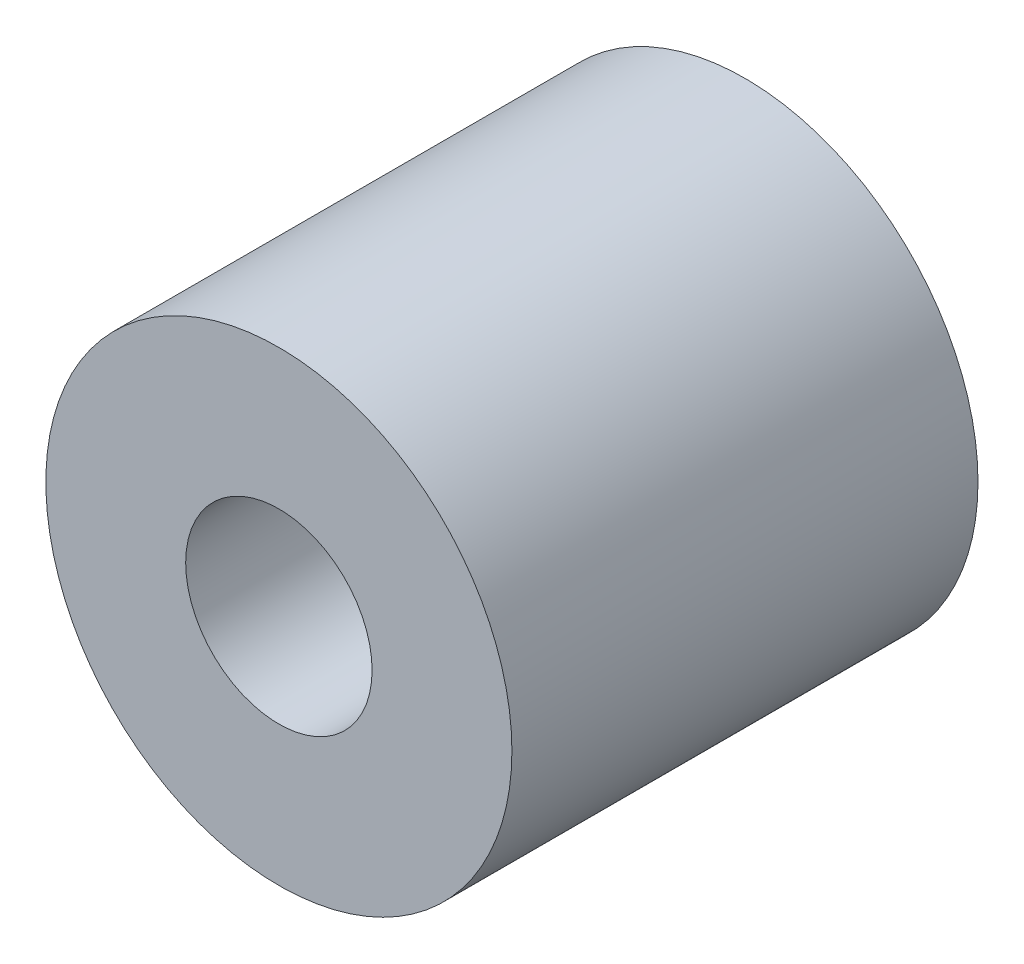
ISO-10303-21;
HEADER;
FILE_DESCRIPTION(('STEP AP214'),'2;1');
FILE_NAME('part.step','',(''),(''),'','','');
FILE_SCHEMA(('AUTOMOTIVE_DESIGN { 1 0 10303 214 1 1 1 1 }'));
ENDSEC;
DATA;
#1=APPLICATION_CONTEXT('core data for automotive mechanical design processes');
#2=APPLICATION_PROTOCOL_DEFINITION('international standard','automotive_design',2000,#1);
#3=PRODUCT_CONTEXT('',#1,'mechanical');
#4=PRODUCT('Part','Part','',(#3));
#5=PRODUCT_RELATED_PRODUCT_CATEGORY('part','',(#4));
#6=PRODUCT_DEFINITION_FORMATION('','',#4);
#7=PRODUCT_DEFINITION_CONTEXT('part definition',#1,'design');
#8=PRODUCT_DEFINITION('design','',#6,#7);
#9=PRODUCT_DEFINITION_SHAPE('','',#8);
#10=(LENGTH_UNIT() NAMED_UNIT(*) SI_UNIT(.MILLI.,.METRE.));
#11=(NAMED_UNIT(*) PLANE_ANGLE_UNIT() SI_UNIT($,.RADIAN.));
#12=(NAMED_UNIT(*) SI_UNIT($,.STERADIAN.) SOLID_ANGLE_UNIT());
#13=UNCERTAINTY_MEASURE_WITH_UNIT(LENGTH_MEASURE(1.E-05),#10,'distance_accuracy_value','');
#14=(GEOMETRIC_REPRESENTATION_CONTEXT(3) GLOBAL_UNCERTAINTY_ASSIGNED_CONTEXT((#13)) GLOBAL_UNIT_ASSIGNED_CONTEXT((#10,
#11,#12)) REPRESENTATION_CONTEXT('',''));
#15=CARTESIAN_POINT('',(0.,0.,0.));
#16=DIRECTION('',(0.,0.,1.));
#17=DIRECTION('',(1.,0.,0.));
#18=AXIS2_PLACEMENT_3D('',#15,#16,#17);
#19=CARTESIAN_POINT('',(0.,0.,5.));
#20=DIRECTION('',(0.,0.,1.));
#21=DIRECTION('',(1.,0.,0.));
#22=AXIS2_PLACEMENT_3D('',#19,#20,#21);
#23=PLANE('',#22);
#24=CARTESIAN_POINT('',(0.,0.,5.));
#25=DIRECTION('',(0.,0.,1.));
#26=DIRECTION('',(1.,0.,0.));
#27=AXIS2_PLACEMENT_3D('',#24,#25,#26);
#28=CIRCLE('',#27,2.5);
#29=CARTESIAN_POINT('',(2.5,0.,5.));
#30=VERTEX_POINT('',#29);
#31=EDGE_CURVE('E10',#30,#30,#28,.T.);
#32=ORIENTED_EDGE('',*,*,#31,.T.);
#33=EDGE_LOOP('',(#32));
#34=FACE_BOUND('',#33,.T.);
#35=CARTESIAN_POINT('',(0.,0.,5.));
#36=DIRECTION('',(0.,0.,1.));
#37=DIRECTION('',(1.,0.,0.));
#38=AXIS2_PLACEMENT_3D('',#35,#36,#37);
#39=CIRCLE('',#38,1.);
#40=CARTESIAN_POINT('',(1.,0.,5.));
#41=VERTEX_POINT('',#40);
#42=EDGE_CURVE('E41',#41,#41,#39,.T.);
#43=ORIENTED_EDGE('',*,*,#42,.F.);
#44=EDGE_LOOP('',(#43));
#45=FACE_BOUND('',#44,.T.);
#46=ADVANCED_FACE('F30',(#34,#45),#23,.T.);
#47=CARTESIAN_POINT('',(0.,0.,0.));
#48=DIRECTION('',(0.,0.,1.));
#49=DIRECTION('',(1.,0.,0.));
#50=AXIS2_PLACEMENT_3D('',#47,#48,#49);
#51=PLANE('',#50);
#52=CARTESIAN_POINT('',(0.,0.,0.));
#53=DIRECTION('',(0.,0.,1.));
#54=DIRECTION('',(1.,0.,0.));
#55=AXIS2_PLACEMENT_3D('',#52,#53,#54);
#56=CIRCLE('',#55,2.5);
#57=CARTESIAN_POINT('',(2.5,0.,0.));
#58=VERTEX_POINT('',#57);
#59=EDGE_CURVE('E34',#58,#58,#56,.T.);
#60=ORIENTED_EDGE('',*,*,#59,.F.);
#61=EDGE_LOOP('',(#60));
#62=FACE_BOUND('',#61,.T.);
#63=CARTESIAN_POINT('',(0.,0.,0.));
#64=DIRECTION('',(0.,0.,1.));
#65=DIRECTION('',(1.,0.,0.));
#66=AXIS2_PLACEMENT_3D('',#63,#64,#65);
#67=CIRCLE('',#66,1.);
#68=CARTESIAN_POINT('',(1.,0.,0.));
#69=VERTEX_POINT('',#68);
#70=EDGE_CURVE('E43',#69,#69,#67,.T.);
#71=ORIENTED_EDGE('',*,*,#70,.T.);
#72=EDGE_LOOP('',(#71));
#73=FACE_BOUND('',#72,.T.);
#74=ADVANCED_FACE('F53',(#62,#73),#51,.F.);
#75=CARTESIAN_POINT('',(0.,0.,5.));
#76=DIRECTION('',(0.,0.,-1.));
#77=DIRECTION('',(-1.,0.,0.));
#78=AXIS2_PLACEMENT_3D('',#75,#76,#77);
#79=CYLINDRICAL_SURFACE('',#78,2.5);
#80=ORIENTED_EDGE('',*,*,#31,.F.);
#81=EDGE_LOOP('',(#80));
#82=FACE_BOUND('',#81,.T.);
#83=ORIENTED_EDGE('',*,*,#59,.T.);
#84=EDGE_LOOP('',(#83));
#85=FACE_BOUND('',#84,.T.);
#86=ADVANCED_FACE('F32',(#82,#85),#79,.T.);
#87=CARTESIAN_POINT('',(0.,0.,5.));
#88=DIRECTION('',(0.,0.,-1.));
#89=DIRECTION('',(-1.,0.,0.));
#90=AXIS2_PLACEMENT_3D('',#87,#88,#89);
#91=CYLINDRICAL_SURFACE('',#90,1.);
#92=ORIENTED_EDGE('',*,*,#42,.T.);
#93=EDGE_LOOP('',(#92));
#94=FACE_BOUND('',#93,.T.);
#95=ORIENTED_EDGE('',*,*,#70,.F.);
#96=EDGE_LOOP('',(#95));
#97=FACE_BOUND('',#96,.T.);
#98=ADVANCED_FACE('F49',(#94,#97),#91,.F.);
#99=CLOSED_SHELL('',(#46,#74,#86,#98));
#100=MANIFOLD_SOLID_BREP('B2',#99);
#101=ADVANCED_BREP_SHAPE_REPRESENTATION('',(#18,#100),#14);
#102=SHAPE_DEFINITION_REPRESENTATION(#9,#101);
ENDSEC;
END-ISO-10303-21;
